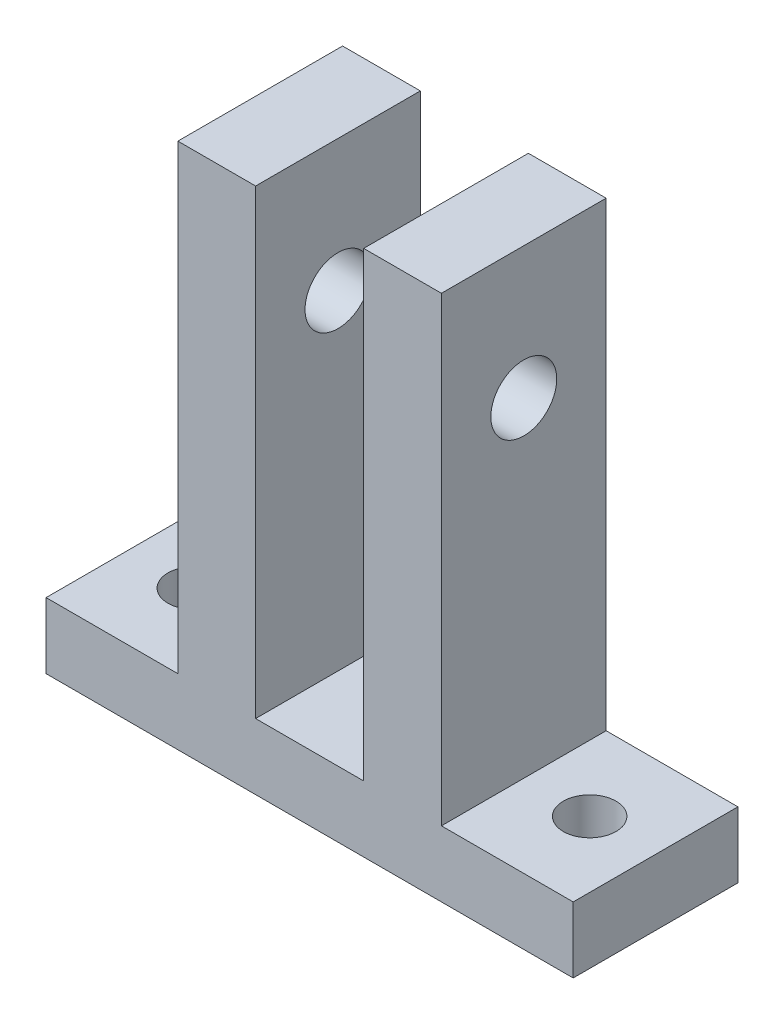
ISO-10303-21;
HEADER;
FILE_DESCRIPTION(('STEP AP214'),'2;1');
FILE_NAME('part.step','',(''),(''),'','','');
FILE_SCHEMA(('AUTOMOTIVE_DESIGN { 1 0 10303 214 1 1 1 1 }'));
ENDSEC;
DATA;
#1=APPLICATION_CONTEXT('core data for automotive mechanical design processes');
#2=APPLICATION_PROTOCOL_DEFINITION('international standard','automotive_design',2000,#1);
#3=PRODUCT_CONTEXT('',#1,'mechanical');
#4=PRODUCT('Part','Part','',(#3));
#5=PRODUCT_RELATED_PRODUCT_CATEGORY('part','',(#4));
#6=PRODUCT_DEFINITION_FORMATION('','',#4);
#7=PRODUCT_DEFINITION_CONTEXT('part definition',#1,'design');
#8=PRODUCT_DEFINITION('design','',#6,#7);
#9=PRODUCT_DEFINITION_SHAPE('','',#8);
#10=(LENGTH_UNIT() NAMED_UNIT(*) SI_UNIT(.MILLI.,.METRE.));
#11=(NAMED_UNIT(*) PLANE_ANGLE_UNIT() SI_UNIT($,.RADIAN.));
#12=(NAMED_UNIT(*) SI_UNIT($,.STERADIAN.) SOLID_ANGLE_UNIT());
#13=UNCERTAINTY_MEASURE_WITH_UNIT(LENGTH_MEASURE(1.E-05),#10,'distance_accuracy_value','');
#14=(GEOMETRIC_REPRESENTATION_CONTEXT(3) GLOBAL_UNCERTAINTY_ASSIGNED_CONTEXT((#13)) GLOBAL_UNIT_ASSIGNED_CONTEXT((#10,
#11,#12)) REPRESENTATION_CONTEXT('',''));
#15=CARTESIAN_POINT('',(0.,0.,0.));
#16=DIRECTION('',(0.,0.,1.));
#17=DIRECTION('',(1.,0.,0.));
#18=AXIS2_PLACEMENT_3D('',#15,#16,#17);
#19=CARTESIAN_POINT('',(40.,0.,12.5));
#20=DIRECTION('',(0.,1.,0.));
#21=DIRECTION('',(-1.,0.,0.));
#22=AXIS2_PLACEMENT_3D('',#19,#20,#21);
#23=PLANE('',#22);
#24=CARTESIAN_POINT('',(5.,0.,6.25));
#25=DIRECTION('',(0.,1.,0.));
#26=DIRECTION('',(-1.,0.,0.));
#27=AXIS2_PLACEMENT_3D('',#24,#25,#26);
#28=CIRCLE('',#27,2.);
#29=CARTESIAN_POINT('',(3.,0.,6.25));
#30=VERTEX_POINT('',#29);
#31=EDGE_CURVE('E261',#30,#30,#28,.F.);
#32=ORIENTED_EDGE('',*,*,#31,.F.);
#33=EDGE_LOOP('',(#32));
#34=FACE_BOUND('',#33,.T.);
#35=CARTESIAN_POINT('',(35.,0.,6.25));
#36=DIRECTION('',(0.,1.,0.));
#37=DIRECTION('',(-1.,0.,0.));
#38=AXIS2_PLACEMENT_3D('',#35,#36,#37);
#39=CIRCLE('',#38,2.);
#40=CARTESIAN_POINT('',(33.,0.,6.25));
#41=VERTEX_POINT('',#40);
#42=EDGE_CURVE('E264',#41,#41,#39,.F.);
#43=ORIENTED_EDGE('',*,*,#42,.F.);
#44=EDGE_LOOP('',(#43));
#45=FACE_BOUND('',#44,.T.);
#46=DIRECTION('',(1.,0.,0.));
#47=VECTOR('',#46,1.);
#48=CARTESIAN_POINT('',(40.,0.,0.));
#49=LINE('',#48,#47);
#50=CARTESIAN_POINT('',(0.,0.,0.));
#51=VERTEX_POINT('',#50);
#52=CARTESIAN_POINT('',(40.,0.,0.));
#53=VERTEX_POINT('',#52);
#54=EDGE_CURVE('E151',#51,#53,#49,.T.);
#55=ORIENTED_EDGE('',*,*,#54,.T.);
#56=DIRECTION('',(0.,0.,-1.));
#57=VECTOR('',#56,1.);
#58=CARTESIAN_POINT('',(40.,0.,12.5));
#59=LINE('',#58,#57);
#60=CARTESIAN_POINT('',(40.,0.,12.5));
#61=VERTEX_POINT('',#60);
#62=EDGE_CURVE('E11',#61,#53,#59,.T.);
#63=ORIENTED_EDGE('',*,*,#62,.F.);
#64=DIRECTION('',(1.,0.,0.));
#65=VECTOR('',#64,1.);
#66=CARTESIAN_POINT('',(40.,0.,12.5));
#67=LINE('',#66,#65);
#68=CARTESIAN_POINT('',(0.,0.,12.5));
#69=VERTEX_POINT('',#68);
#70=EDGE_CURVE('E174',#69,#61,#67,.T.);
#71=ORIENTED_EDGE('',*,*,#70,.F.);
#72=DIRECTION('',(0.,0.,-1.));
#73=VECTOR('',#72,1.);
#74=CARTESIAN_POINT('',(0.,0.,12.5));
#75=LINE('',#74,#73);
#76=EDGE_CURVE('E147',#69,#51,#75,.T.);
#77=ORIENTED_EDGE('',*,*,#76,.T.);
#78=EDGE_LOOP('',(#55,#63,#71,#77));
#79=FACE_BOUND('',#78,.T.);
#80=ADVANCED_FACE('F31',(#34,#45,#79),#23,.F.);
#81=CARTESIAN_POINT('',(40.,5.,12.5));
#82=DIRECTION('',(-1.,0.,0.));
#83=DIRECTION('',(0.,0.,1.));
#84=AXIS2_PLACEMENT_3D('',#81,#82,#83);
#85=PLANE('',#84);
#86=DIRECTION('',(0.,1.,0.));
#87=VECTOR('',#86,1.);
#88=CARTESIAN_POINT('',(40.,5.,0.));
#89=LINE('',#88,#87);
#90=CARTESIAN_POINT('',(40.,5.,0.));
#91=VERTEX_POINT('',#90);
#92=EDGE_CURVE('E154',#53,#91,#89,.T.);
#93=ORIENTED_EDGE('',*,*,#92,.T.);
#94=DIRECTION('',(0.,0.,-1.));
#95=VECTOR('',#94,1.);
#96=CARTESIAN_POINT('',(40.,5.,12.5));
#97=LINE('',#96,#95);
#98=CARTESIAN_POINT('',(40.,5.,12.5));
#99=VERTEX_POINT('',#98);
#100=EDGE_CURVE('E39',#99,#91,#97,.T.);
#101=ORIENTED_EDGE('',*,*,#100,.F.);
#102=DIRECTION('',(0.,1.,0.));
#103=VECTOR('',#102,1.);
#104=CARTESIAN_POINT('',(40.,5.,12.5));
#105=LINE('',#104,#103);
#106=EDGE_CURVE('E102',#61,#99,#105,.T.);
#107=ORIENTED_EDGE('',*,*,#106,.F.);
#108=ORIENTED_EDGE('',*,*,#62,.T.);
#109=EDGE_LOOP('',(#93,#101,#107,#108));
#110=FACE_BOUND('',#109,.T.);
#111=ADVANCED_FACE('F253',(#110),#85,.F.);
#112=CARTESIAN_POINT('',(30.,5.,12.5));
#113=DIRECTION('',(0.,-1.,0.));
#114=DIRECTION('',(0.,0.,-1.));
#115=AXIS2_PLACEMENT_3D('',#112,#113,#114);
#116=PLANE('',#115);
#117=CARTESIAN_POINT('',(35.,5.,6.25));
#118=DIRECTION('',(0.,1.,0.));
#119=DIRECTION('',(0.,0.,1.));
#120=AXIS2_PLACEMENT_3D('',#117,#118,#119);
#121=CIRCLE('',#120,2.);
#122=CARTESIAN_POINT('',(35.,5.,8.25));
#123=VERTEX_POINT('',#122);
#124=EDGE_CURVE('E267',#123,#123,#121,.T.);
#125=ORIENTED_EDGE('',*,*,#124,.F.);
#126=EDGE_LOOP('',(#125));
#127=FACE_BOUND('',#126,.T.);
#128=DIRECTION('',(-1.,0.,0.));
#129=VECTOR('',#128,1.);
#130=CARTESIAN_POINT('',(30.,5.,0.));
#131=LINE('',#130,#129);
#132=CARTESIAN_POINT('',(30.,5.,0.));
#133=VERTEX_POINT('',#132);
#134=EDGE_CURVE('E157',#91,#133,#131,.T.);
#135=ORIENTED_EDGE('',*,*,#134,.T.);
#136=DIRECTION('',(0.,0.,-1.));
#137=VECTOR('',#136,1.);
#138=CARTESIAN_POINT('',(30.,5.,12.5));
#139=LINE('',#138,#137);
#140=CARTESIAN_POINT('',(30.,5.,12.5));
#141=VERTEX_POINT('',#140);
#142=EDGE_CURVE('E193',#141,#133,#139,.T.);
#143=ORIENTED_EDGE('',*,*,#142,.F.);
#144=DIRECTION('',(-1.,0.,0.));
#145=VECTOR('',#144,1.);
#146=CARTESIAN_POINT('',(30.,5.,12.5));
#147=LINE('',#146,#145);
#148=EDGE_CURVE('E201',#99,#141,#147,.T.);
#149=ORIENTED_EDGE('',*,*,#148,.F.);
#150=ORIENTED_EDGE('',*,*,#100,.T.);
#151=EDGE_LOOP('',(#135,#143,#149,#150));
#152=FACE_BOUND('',#151,.T.);
#153=ADVANCED_FACE('F199',(#127,#152),#116,.F.);
#154=CARTESIAN_POINT('',(30.,40.,12.5));
#155=DIRECTION('',(-1.,0.,0.));
#156=DIRECTION('',(0.,0.,1.));
#157=AXIS2_PLACEMENT_3D('',#154,#155,#156);
#158=PLANE('',#157);
#159=CARTESIAN_POINT('',(30.,30.,6.25));
#160=DIRECTION('',(-1.,0.,0.));
#161=DIRECTION('',(0.,0.,1.));
#162=AXIS2_PLACEMENT_3D('',#159,#160,#161);
#163=CIRCLE('',#162,2.5);
#164=CARTESIAN_POINT('',(30.,30.,8.75));
#165=VERTEX_POINT('',#164);
#166=EDGE_CURVE('E155',#165,#165,#163,.T.);
#167=ORIENTED_EDGE('',*,*,#166,.T.);
#168=EDGE_LOOP('',(#167));
#169=FACE_BOUND('',#168,.T.);
#170=DIRECTION('',(0.,1.,0.));
#171=VECTOR('',#170,1.);
#172=CARTESIAN_POINT('',(30.,40.,0.));
#173=LINE('',#172,#171);
#174=CARTESIAN_POINT('',(30.,40.,0.));
#175=VERTEX_POINT('',#174);
#176=EDGE_CURVE('E159',#133,#175,#173,.T.);
#177=ORIENTED_EDGE('',*,*,#176,.T.);
#178=DIRECTION('',(0.,0.,-1.));
#179=VECTOR('',#178,1.);
#180=CARTESIAN_POINT('',(30.,40.,12.5));
#181=LINE('',#180,#179);
#182=CARTESIAN_POINT('',(30.,40.,12.5));
#183=VERTEX_POINT('',#182);
#184=EDGE_CURVE('E190',#183,#175,#181,.T.);
#185=ORIENTED_EDGE('',*,*,#184,.F.);
#186=DIRECTION('',(0.,1.,0.));
#187=VECTOR('',#186,1.);
#188=CARTESIAN_POINT('',(30.,40.,12.5));
#189=LINE('',#188,#187);
#190=EDGE_CURVE('E219',#141,#183,#189,.T.);
#191=ORIENTED_EDGE('',*,*,#190,.F.);
#192=ORIENTED_EDGE('',*,*,#142,.T.);
#193=EDGE_LOOP('',(#177,#185,#191,#192));
#194=FACE_BOUND('',#193,.T.);
#195=ADVANCED_FACE('F210',(#169,#194),#158,.F.);
#196=CARTESIAN_POINT('',(24.1,40.,12.5));
#197=DIRECTION('',(0.,-1.,0.));
#198=DIRECTION('',(0.,0.,-1.));
#199=AXIS2_PLACEMENT_3D('',#196,#197,#198);
#200=PLANE('',#199);
#201=DIRECTION('',(-1.,0.,0.));
#202=VECTOR('',#201,1.);
#203=CARTESIAN_POINT('',(24.1,40.,0.));
#204=LINE('',#203,#202);
#205=CARTESIAN_POINT('',(24.1,40.,0.));
#206=VERTEX_POINT('',#205);
#207=EDGE_CURVE('E161',#175,#206,#204,.T.);
#208=ORIENTED_EDGE('',*,*,#207,.T.);
#209=DIRECTION('',(0.,0.,-1.));
#210=VECTOR('',#209,1.);
#211=CARTESIAN_POINT('',(24.1,40.,12.5));
#212=LINE('',#211,#210);
#213=CARTESIAN_POINT('',(24.1,40.,12.5));
#214=VERTEX_POINT('',#213);
#215=EDGE_CURVE('E187',#214,#206,#212,.T.);
#216=ORIENTED_EDGE('',*,*,#215,.F.);
#217=DIRECTION('',(-1.,0.,0.));
#218=VECTOR('',#217,1.);
#219=CARTESIAN_POINT('',(24.1,40.,12.5));
#220=LINE('',#219,#218);
#221=EDGE_CURVE('E216',#183,#214,#220,.T.);
#222=ORIENTED_EDGE('',*,*,#221,.F.);
#223=ORIENTED_EDGE('',*,*,#184,.T.);
#224=EDGE_LOOP('',(#208,#216,#222,#223));
#225=FACE_BOUND('',#224,.T.);
#226=ADVANCED_FACE('F214',(#225),#200,.F.);
#227=CARTESIAN_POINT('',(24.1,5.,12.5));
#228=DIRECTION('',(1.,0.,0.));
#229=DIRECTION('',(0.,0.,-1.));
#230=AXIS2_PLACEMENT_3D('',#227,#228,#229);
#231=PLANE('',#230);
#232=CARTESIAN_POINT('',(24.1,30.,6.25));
#233=DIRECTION('',(1.,0.,0.));
#234=DIRECTION('',(0.,0.,-1.));
#235=AXIS2_PLACEMENT_3D('',#232,#233,#234);
#236=CIRCLE('',#235,2.5);
#237=CARTESIAN_POINT('',(24.1,30.,3.75));
#238=VERTEX_POINT('',#237);
#239=EDGE_CURVE('E278',#238,#238,#236,.T.);
#240=ORIENTED_EDGE('',*,*,#239,.T.);
#241=EDGE_LOOP('',(#240));
#242=FACE_BOUND('',#241,.T.);
#243=DIRECTION('',(0.,-1.,0.));
#244=VECTOR('',#243,1.);
#245=CARTESIAN_POINT('',(24.1,5.,0.));
#246=LINE('',#245,#244);
#247=CARTESIAN_POINT('',(24.1,5.,0.));
#248=VERTEX_POINT('',#247);
#249=EDGE_CURVE('E163',#206,#248,#246,.T.);
#250=ORIENTED_EDGE('',*,*,#249,.T.);
#251=DIRECTION('',(0.,0.,-1.));
#252=VECTOR('',#251,1.);
#253=CARTESIAN_POINT('',(24.1,5.,12.5));
#254=LINE('',#253,#252);
#255=CARTESIAN_POINT('',(24.1,5.,12.5));
#256=VERTEX_POINT('',#255);
#257=EDGE_CURVE('E184',#256,#248,#254,.T.);
#258=ORIENTED_EDGE('',*,*,#257,.F.);
#259=DIRECTION('',(0.,-1.,0.));
#260=VECTOR('',#259,1.);
#261=CARTESIAN_POINT('',(24.1,5.,12.5));
#262=LINE('',#261,#260);
#263=EDGE_CURVE('E218',#214,#256,#262,.T.);
#264=ORIENTED_EDGE('',*,*,#263,.F.);
#265=ORIENTED_EDGE('',*,*,#215,.T.);
#266=EDGE_LOOP('',(#250,#258,#264,#265));
#267=FACE_BOUND('',#266,.T.);
#268=ADVANCED_FACE('F389',(#242,#267),#231,.F.);
#269=CARTESIAN_POINT('',(15.9,5.,12.5));
#270=DIRECTION('',(0.,-1.,0.));
#271=DIRECTION('',(0.,0.,-1.));
#272=AXIS2_PLACEMENT_3D('',#269,#270,#271);
#273=PLANE('',#272);
#274=DIRECTION('',(-1.,0.,0.));
#275=VECTOR('',#274,1.);
#276=CARTESIAN_POINT('',(15.9,5.,0.));
#277=LINE('',#276,#275);
#278=CARTESIAN_POINT('',(15.9,5.,0.));
#279=VERTEX_POINT('',#278);
#280=EDGE_CURVE('E165',#248,#279,#277,.T.);
#281=ORIENTED_EDGE('',*,*,#280,.T.);
#282=DIRECTION('',(0.,0.,-1.));
#283=VECTOR('',#282,1.);
#284=CARTESIAN_POINT('',(15.9,5.,12.5));
#285=LINE('',#284,#283);
#286=CARTESIAN_POINT('',(15.9,5.,12.5));
#287=VERTEX_POINT('',#286);
#288=EDGE_CURVE('E181',#287,#279,#285,.T.);
#289=ORIENTED_EDGE('',*,*,#288,.F.);
#290=DIRECTION('',(-1.,0.,0.));
#291=VECTOR('',#290,1.);
#292=CARTESIAN_POINT('',(15.9,5.,12.5));
#293=LINE('',#292,#291);
#294=EDGE_CURVE('E221',#256,#287,#293,.T.);
#295=ORIENTED_EDGE('',*,*,#294,.F.);
#296=ORIENTED_EDGE('',*,*,#257,.T.);
#297=EDGE_LOOP('',(#281,#289,#295,#296));
#298=FACE_BOUND('',#297,.T.);
#299=ADVANCED_FACE('F381',(#298),#273,.F.);
#300=CARTESIAN_POINT('',(15.9,40.,12.5));
#301=DIRECTION('',(-1.,0.,0.));
#302=DIRECTION('',(0.,0.,1.));
#303=AXIS2_PLACEMENT_3D('',#300,#301,#302);
#304=PLANE('',#303);
#305=CARTESIAN_POINT('',(15.9,30.,6.25));
#306=DIRECTION('',(-1.,0.,0.));
#307=DIRECTION('',(0.,0.,1.));
#308=AXIS2_PLACEMENT_3D('',#305,#306,#307);
#309=CIRCLE('',#308,2.5);
#310=CARTESIAN_POINT('',(15.9,30.,8.75));
#311=VERTEX_POINT('',#310);
#312=EDGE_CURVE('E270',#311,#311,#309,.T.);
#313=ORIENTED_EDGE('',*,*,#312,.T.);
#314=EDGE_LOOP('',(#313));
#315=FACE_BOUND('',#314,.T.);
#316=DIRECTION('',(0.,1.,0.));
#317=VECTOR('',#316,1.);
#318=CARTESIAN_POINT('',(15.9,40.,0.));
#319=LINE('',#318,#317);
#320=CARTESIAN_POINT('',(15.9,40.,0.));
#321=VERTEX_POINT('',#320);
#322=EDGE_CURVE('E167',#279,#321,#319,.T.);
#323=ORIENTED_EDGE('',*,*,#322,.T.);
#324=DIRECTION('',(0.,0.,-1.));
#325=VECTOR('',#324,1.);
#326=CARTESIAN_POINT('',(15.9,40.,12.5));
#327=LINE('',#326,#325);
#328=CARTESIAN_POINT('',(15.9,40.,12.5));
#329=VERTEX_POINT('',#328);
#330=EDGE_CURVE('E178',#329,#321,#327,.T.);
#331=ORIENTED_EDGE('',*,*,#330,.F.);
#332=DIRECTION('',(0.,1.,0.));
#333=VECTOR('',#332,1.);
#334=CARTESIAN_POINT('',(15.9,40.,12.5));
#335=LINE('',#334,#333);
#336=EDGE_CURVE('E227',#287,#329,#335,.T.);
#337=ORIENTED_EDGE('',*,*,#336,.F.);
#338=ORIENTED_EDGE('',*,*,#288,.T.);
#339=EDGE_LOOP('',(#323,#331,#337,#338));
#340=FACE_BOUND('',#339,.T.);
#341=ADVANCED_FACE('F233',(#315,#340),#304,.F.);
#342=CARTESIAN_POINT('',(10.,40.,12.5));
#343=DIRECTION('',(0.,-1.,0.));
#344=DIRECTION('',(0.,0.,-1.));
#345=AXIS2_PLACEMENT_3D('',#342,#343,#344);
#346=PLANE('',#345);
#347=DIRECTION('',(-1.,0.,0.));
#348=VECTOR('',#347,1.);
#349=CARTESIAN_POINT('',(10.,40.,0.));
#350=LINE('',#349,#348);
#351=CARTESIAN_POINT('',(10.,40.,0.));
#352=VERTEX_POINT('',#351);
#353=EDGE_CURVE('E169',#321,#352,#350,.T.);
#354=ORIENTED_EDGE('',*,*,#353,.T.);
#355=DIRECTION('',(0.,0.,-1.));
#356=VECTOR('',#355,1.);
#357=CARTESIAN_POINT('',(10.,40.,12.5));
#358=LINE('',#357,#356);
#359=CARTESIAN_POINT('',(10.,40.,12.5));
#360=VERTEX_POINT('',#359);
#361=EDGE_CURVE('E142',#360,#352,#358,.T.);
#362=ORIENTED_EDGE('',*,*,#361,.F.);
#363=DIRECTION('',(-1.,0.,0.));
#364=VECTOR('',#363,1.);
#365=CARTESIAN_POINT('',(10.,40.,12.5));
#366=LINE('',#365,#364);
#367=EDGE_CURVE('E133',#329,#360,#366,.T.);
#368=ORIENTED_EDGE('',*,*,#367,.F.);
#369=ORIENTED_EDGE('',*,*,#330,.T.);
#370=EDGE_LOOP('',(#354,#362,#368,#369));
#371=FACE_BOUND('',#370,.T.);
#372=ADVANCED_FACE('F237',(#371),#346,.F.);
#373=CARTESIAN_POINT('',(10.,5.,12.5));
#374=DIRECTION('',(1.,0.,0.));
#375=DIRECTION('',(0.,0.,-1.));
#376=AXIS2_PLACEMENT_3D('',#373,#374,#375);
#377=PLANE('',#376);
#378=CARTESIAN_POINT('',(10.,30.,6.25));
#379=DIRECTION('',(-1.,0.,0.));
#380=DIRECTION('',(0.,0.,1.));
#381=AXIS2_PLACEMENT_3D('',#378,#379,#380);
#382=CIRCLE('',#381,2.5);
#383=CARTESIAN_POINT('',(10.,30.,8.75));
#384=VERTEX_POINT('',#383);
#385=EDGE_CURVE('E266',#384,#384,#382,.T.);
#386=ORIENTED_EDGE('',*,*,#385,.F.);
#387=EDGE_LOOP('',(#386));
#388=FACE_BOUND('',#387,.T.);
#389=DIRECTION('',(0.,-1.,0.));
#390=VECTOR('',#389,1.);
#391=CARTESIAN_POINT('',(10.,5.,0.));
#392=LINE('',#391,#390);
#393=CARTESIAN_POINT('',(10.,5.,0.));
#394=VERTEX_POINT('',#393);
#395=EDGE_CURVE('E141',#352,#394,#392,.T.);
#396=ORIENTED_EDGE('',*,*,#395,.T.);
#397=DIRECTION('',(0.,0.,-1.));
#398=VECTOR('',#397,1.);
#399=CARTESIAN_POINT('',(10.,5.,12.5));
#400=LINE('',#399,#398);
#401=CARTESIAN_POINT('',(10.,5.,12.5));
#402=VERTEX_POINT('',#401);
#403=EDGE_CURVE('E138',#402,#394,#400,.T.);
#404=ORIENTED_EDGE('',*,*,#403,.F.);
#405=DIRECTION('',(0.,-1.,0.));
#406=VECTOR('',#405,1.);
#407=CARTESIAN_POINT('',(10.,5.,12.5));
#408=LINE('',#407,#406);
#409=EDGE_CURVE('E127',#360,#402,#408,.T.);
#410=ORIENTED_EDGE('',*,*,#409,.F.);
#411=ORIENTED_EDGE('',*,*,#361,.T.);
#412=EDGE_LOOP('',(#396,#404,#410,#411));
#413=FACE_BOUND('',#412,.T.);
#414=ADVANCED_FACE('F139',(#388,#413),#377,.F.);
#415=CARTESIAN_POINT('',(0.,5.,12.5));
#416=DIRECTION('',(0.,-1.,0.));
#417=DIRECTION('',(0.,0.,-1.));
#418=AXIS2_PLACEMENT_3D('',#415,#416,#417);
#419=PLANE('',#418);
#420=CARTESIAN_POINT('',(5.,5.,6.25));
#421=DIRECTION('',(0.,1.,0.));
#422=DIRECTION('',(0.,0.,1.));
#423=AXIS2_PLACEMENT_3D('',#420,#421,#422);
#424=CIRCLE('',#423,2.);
#425=CARTESIAN_POINT('',(5.,5.,8.25));
#426=VERTEX_POINT('',#425);
#427=EDGE_CURVE('E366',#426,#426,#424,.T.);
#428=ORIENTED_EDGE('',*,*,#427,.F.);
#429=EDGE_LOOP('',(#428));
#430=FACE_BOUND('',#429,.T.);
#431=DIRECTION('',(-1.,0.,0.));
#432=VECTOR('',#431,1.);
#433=CARTESIAN_POINT('',(0.,5.,0.));
#434=LINE('',#433,#432);
#435=CARTESIAN_POINT('',(0.,5.,0.));
#436=VERTEX_POINT('',#435);
#437=EDGE_CURVE('E88',#394,#436,#434,.T.);
#438=ORIENTED_EDGE('',*,*,#437,.T.);
#439=DIRECTION('',(0.,0.,-1.));
#440=VECTOR('',#439,1.);
#441=CARTESIAN_POINT('',(0.,5.,12.5));
#442=LINE('',#441,#440);
#443=CARTESIAN_POINT('',(0.,5.,12.5));
#444=VERTEX_POINT('',#443);
#445=EDGE_CURVE('E143',#444,#436,#442,.T.);
#446=ORIENTED_EDGE('',*,*,#445,.F.);
#447=DIRECTION('',(-1.,0.,0.));
#448=VECTOR('',#447,1.);
#449=CARTESIAN_POINT('',(0.,5.,12.5));
#450=LINE('',#449,#448);
#451=EDGE_CURVE('E131',#402,#444,#450,.T.);
#452=ORIENTED_EDGE('',*,*,#451,.F.);
#453=ORIENTED_EDGE('',*,*,#403,.T.);
#454=EDGE_LOOP('',(#438,#446,#452,#453));
#455=FACE_BOUND('',#454,.T.);
#456=ADVANCED_FACE('F145',(#430,#455),#419,.F.);
#457=CARTESIAN_POINT('',(0.,0.,12.5));
#458=DIRECTION('',(1.,0.,0.));
#459=DIRECTION('',(0.,0.,-1.));
#460=AXIS2_PLACEMENT_3D('',#457,#458,#459);
#461=PLANE('',#460);
#462=DIRECTION('',(0.,-1.,0.));
#463=VECTOR('',#462,1.);
#464=CARTESIAN_POINT('',(0.,0.,0.));
#465=LINE('',#464,#463);
#466=EDGE_CURVE('E94',#436,#51,#465,.T.);
#467=ORIENTED_EDGE('',*,*,#466,.T.);
#468=ORIENTED_EDGE('',*,*,#76,.F.);
#469=DIRECTION('',(0.,-1.,0.));
#470=VECTOR('',#469,1.);
#471=CARTESIAN_POINT('',(0.,0.,12.5));
#472=LINE('',#471,#470);
#473=EDGE_CURVE('E47',#444,#69,#472,.T.);
#474=ORIENTED_EDGE('',*,*,#473,.F.);
#475=ORIENTED_EDGE('',*,*,#445,.T.);
#476=EDGE_LOOP('',(#467,#468,#474,#475));
#477=FACE_BOUND('',#476,.T.);
#478=ADVANCED_FACE('F241',(#477),#461,.F.);
#479=CARTESIAN_POINT('',(0.,0.,12.5));
#480=DIRECTION('',(0.,0.,-1.));
#481=DIRECTION('',(-1.,0.,0.));
#482=AXIS2_PLACEMENT_3D('',#479,#480,#481);
#483=PLANE('',#482);
#484=ORIENTED_EDGE('',*,*,#70,.T.);
#485=ORIENTED_EDGE('',*,*,#106,.T.);
#486=ORIENTED_EDGE('',*,*,#148,.T.);
#487=ORIENTED_EDGE('',*,*,#190,.T.);
#488=ORIENTED_EDGE('',*,*,#221,.T.);
#489=ORIENTED_EDGE('',*,*,#263,.T.);
#490=ORIENTED_EDGE('',*,*,#294,.T.);
#491=ORIENTED_EDGE('',*,*,#336,.T.);
#492=ORIENTED_EDGE('',*,*,#367,.T.);
#493=ORIENTED_EDGE('',*,*,#409,.T.);
#494=ORIENTED_EDGE('',*,*,#451,.T.);
#495=ORIENTED_EDGE('',*,*,#473,.T.);
#496=EDGE_LOOP('',(#484,#485,#486,#487,#488,#489,#490,#491,#492,#493,#494,#495));
#497=FACE_BOUND('',#496,.T.);
#498=ADVANCED_FACE('F129',(#497),#483,.F.);
#499=CARTESIAN_POINT('',(0.,0.,0.));
#500=DIRECTION('',(0.,0.,-1.));
#501=DIRECTION('',(-1.,0.,0.));
#502=AXIS2_PLACEMENT_3D('',#499,#500,#501);
#503=PLANE('',#502);
#504=ORIENTED_EDGE('',*,*,#54,.F.);
#505=ORIENTED_EDGE('',*,*,#466,.F.);
#506=ORIENTED_EDGE('',*,*,#437,.F.);
#507=ORIENTED_EDGE('',*,*,#395,.F.);
#508=ORIENTED_EDGE('',*,*,#353,.F.);
#509=ORIENTED_EDGE('',*,*,#322,.F.);
#510=ORIENTED_EDGE('',*,*,#280,.F.);
#511=ORIENTED_EDGE('',*,*,#249,.F.);
#512=ORIENTED_EDGE('',*,*,#207,.F.);
#513=ORIENTED_EDGE('',*,*,#176,.F.);
#514=ORIENTED_EDGE('',*,*,#134,.F.);
#515=ORIENTED_EDGE('',*,*,#92,.F.);
#516=EDGE_LOOP('',(#504,#505,#506,#507,#508,#509,#510,#511,#512,#513,#514,#515));
#517=FACE_BOUND('',#516,.T.);
#518=ADVANCED_FACE('F205',(#517),#503,.T.);
#519=CARTESIAN_POINT('',(40.,30.,6.25));
#520=DIRECTION('',(-1.,0.,0.));
#521=DIRECTION('',(0.,0.,1.));
#522=AXIS2_PLACEMENT_3D('',#519,#520,#521);
#523=CYLINDRICAL_SURFACE('',#522,2.5);
#524=ORIENTED_EDGE('',*,*,#385,.T.);
#525=EDGE_LOOP('',(#524));
#526=FACE_BOUND('',#525,.T.);
#527=ORIENTED_EDGE('',*,*,#312,.F.);
#528=EDGE_LOOP('',(#527));
#529=FACE_BOUND('',#528,.T.);
#530=ADVANCED_FACE('F290',(#526,#529),#523,.F.);
#531=ORIENTED_EDGE('',*,*,#239,.F.);
#532=EDGE_LOOP('',(#531));
#533=FACE_BOUND('',#532,.T.);
#534=ORIENTED_EDGE('',*,*,#166,.F.);
#535=EDGE_LOOP('',(#534));
#536=FACE_BOUND('',#535,.T.);
#537=ADVANCED_FACE('F287',(#533,#536),#523,.F.);
#538=CARTESIAN_POINT('',(35.,-0.0010000000000062,6.25));
#539=DIRECTION('',(0.,1.,0.));
#540=DIRECTION('',(0.,0.,1.));
#541=AXIS2_PLACEMENT_3D('',#538,#539,#540);
#542=CYLINDRICAL_SURFACE('',#541,2.);
#543=ORIENTED_EDGE('',*,*,#124,.T.);
#544=EDGE_LOOP('',(#543));
#545=FACE_BOUND('',#544,.T.);
#546=ORIENTED_EDGE('',*,*,#42,.T.);
#547=EDGE_LOOP('',(#546));
#548=FACE_BOUND('',#547,.T.);
#549=ADVANCED_FACE('F289',(#545,#548),#542,.F.);
#550=CARTESIAN_POINT('',(5.,-0.0010000000000062,6.25));
#551=DIRECTION('',(0.,1.,0.));
#552=DIRECTION('',(0.,0.,1.));
#553=AXIS2_PLACEMENT_3D('',#550,#551,#552);
#554=CYLINDRICAL_SURFACE('',#553,2.);
#555=ORIENTED_EDGE('',*,*,#427,.T.);
#556=EDGE_LOOP('',(#555));
#557=FACE_BOUND('',#556,.T.);
#558=ORIENTED_EDGE('',*,*,#31,.T.);
#559=EDGE_LOOP('',(#558));
#560=FACE_BOUND('',#559,.T.);
#561=ADVANCED_FACE('F297',(#557,#560),#554,.F.);
#562=CLOSED_SHELL('',(#80,#111,#153,#195,#226,#268,#299,#341,#372,#414,#456,#478,#498,#518,#530,
#537,#549,#561));
#563=MANIFOLD_SOLID_BREP('B2',#562);
#564=ADVANCED_BREP_SHAPE_REPRESENTATION('',(#18,#563),#14);
#565=SHAPE_DEFINITION_REPRESENTATION(#9,#564);
ENDSEC;
END-ISO-10303-21;
